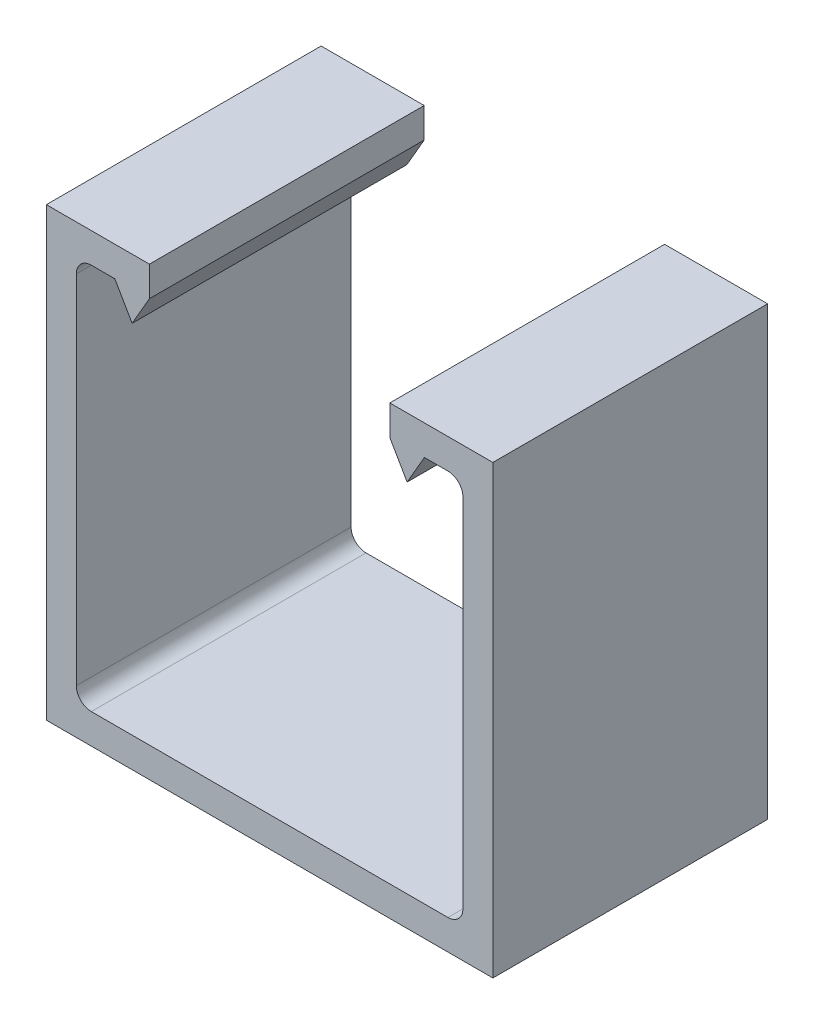
ISO-10303-21;
HEADER;
FILE_DESCRIPTION(('STEP AP214'),'2;1');
FILE_NAME('part.step','',(''),(''),'','','');
FILE_SCHEMA(('AUTOMOTIVE_DESIGN { 1 0 10303 214 1 1 1 1 }'));
ENDSEC;
DATA;
#1=APPLICATION_CONTEXT('core data for automotive mechanical design processes');
#2=APPLICATION_PROTOCOL_DEFINITION('international standard','automotive_design',2000,#1);
#3=PRODUCT_CONTEXT('',#1,'mechanical');
#4=PRODUCT('Part','Part','',(#3));
#5=PRODUCT_RELATED_PRODUCT_CATEGORY('part','',(#4));
#6=PRODUCT_DEFINITION_FORMATION('','',#4);
#7=PRODUCT_DEFINITION_CONTEXT('part definition',#1,'design');
#8=PRODUCT_DEFINITION('design','',#6,#7);
#9=PRODUCT_DEFINITION_SHAPE('','',#8);
#10=(LENGTH_UNIT() NAMED_UNIT(*) SI_UNIT(.MILLI.,.METRE.));
#11=(NAMED_UNIT(*) PLANE_ANGLE_UNIT() SI_UNIT($,.RADIAN.));
#12=(NAMED_UNIT(*) SI_UNIT($,.STERADIAN.) SOLID_ANGLE_UNIT());
#13=UNCERTAINTY_MEASURE_WITH_UNIT(LENGTH_MEASURE(1.E-05),#10,'distance_accuracy_value','');
#14=(GEOMETRIC_REPRESENTATION_CONTEXT(3) GLOBAL_UNCERTAINTY_ASSIGNED_CONTEXT((#13)) GLOBAL_UNIT_ASSIGNED_CONTEXT((#10,
#11,#12)) REPRESENTATION_CONTEXT('',''));
#15=CARTESIAN_POINT('',(0.,0.,0.));
#16=DIRECTION('',(0.,0.,1.));
#17=DIRECTION('',(1.,0.,0.));
#18=AXIS2_PLACEMENT_3D('',#15,#16,#17);
#19=CARTESIAN_POINT('',(-16.4846,-16.4846,12.7));
#20=DIRECTION('',(0.,0.,-1.));
#21=DIRECTION('',(-1.,0.,0.));
#22=AXIS2_PLACEMENT_3D('',#19,#20,#21);
#23=CYLINDRICAL_SURFACE('',#22,1.3843);
#24=CARTESIAN_POINT('',(-16.4846,-16.4846,-12.7));
#25=DIRECTION('',(0.,0.,-1.));
#26=DIRECTION('',(1.,0.,0.));
#27=AXIS2_PLACEMENT_3D('',#24,#25,#26);
#28=CIRCLE('',#27,1.3843);
#29=CARTESIAN_POINT('',(-16.4846,-17.8689,-12.7));
#30=VERTEX_POINT('',#29);
#31=CARTESIAN_POINT('',(-17.8689,-16.4846,-12.7));
#32=VERTEX_POINT('',#31);
#33=EDGE_CURVE('E200',#30,#32,#28,.T.);
#34=ORIENTED_EDGE('',*,*,#33,.T.);
#35=DIRECTION('',(0.,0.,-1.));
#36=VECTOR('',#35,1.);
#37=CARTESIAN_POINT('',(-17.8689,-16.4846,12.7));
#38=LINE('',#37,#36);
#39=CARTESIAN_POINT('',(-17.8689,-16.4846,12.7));
#40=VERTEX_POINT('',#39);
#41=EDGE_CURVE('E11',#40,#32,#38,.T.);
#42=ORIENTED_EDGE('',*,*,#41,.F.);
#43=CARTESIAN_POINT('',(-16.4846,-16.4846,12.7));
#44=DIRECTION('',(0.,0.,-1.));
#45=DIRECTION('',(1.,0.,0.));
#46=AXIS2_PLACEMENT_3D('',#43,#44,#45);
#47=CIRCLE('',#46,1.3843);
#48=CARTESIAN_POINT('',(-16.4846,-17.8689,12.7));
#49=VERTEX_POINT('',#48);
#50=EDGE_CURVE('E238',#49,#40,#47,.T.);
#51=ORIENTED_EDGE('',*,*,#50,.F.);
#52=DIRECTION('',(0.,0.,-1.));
#53=VECTOR('',#52,1.);
#54=CARTESIAN_POINT('',(-16.4846,-17.8689,12.7));
#55=LINE('',#54,#53);
#56=EDGE_CURVE('E196',#49,#30,#55,.T.);
#57=ORIENTED_EDGE('',*,*,#56,.T.);
#58=EDGE_LOOP('',(#34,#42,#51,#57));
#59=FACE_BOUND('',#58,.T.);
#60=ADVANCED_FACE('F32',(#59),#23,.F.);
#61=CARTESIAN_POINT('',(-17.8689,16.4846,12.7));
#62=DIRECTION('',(-1.,0.,0.));
#63=DIRECTION('',(0.,0.,1.));
#64=AXIS2_PLACEMENT_3D('',#61,#62,#63);
#65=PLANE('',#64);
#66=DIRECTION('',(0.,1.,0.));
#67=VECTOR('',#66,1.);
#68=CARTESIAN_POINT('',(-17.8689,16.4846,-12.7));
#69=LINE('',#68,#67);
#70=CARTESIAN_POINT('',(-17.8689,16.4846,-12.7));
#71=VERTEX_POINT('',#70);
#72=EDGE_CURVE('E203',#32,#71,#69,.T.);
#73=ORIENTED_EDGE('',*,*,#72,.T.);
#74=DIRECTION('',(0.,0.,-1.));
#75=VECTOR('',#74,1.);
#76=CARTESIAN_POINT('',(-17.8689,16.4846,12.7));
#77=LINE('',#76,#75);
#78=CARTESIAN_POINT('',(-17.8689,16.4846,12.7));
#79=VERTEX_POINT('',#78);
#80=EDGE_CURVE('E40',#79,#71,#77,.T.);
#81=ORIENTED_EDGE('',*,*,#80,.F.);
#82=DIRECTION('',(0.,1.,0.));
#83=VECTOR('',#82,1.);
#84=CARTESIAN_POINT('',(-17.8689,16.4846,12.7));
#85=LINE('',#84,#83);
#86=EDGE_CURVE('E127',#40,#79,#85,.T.);
#87=ORIENTED_EDGE('',*,*,#86,.F.);
#88=ORIENTED_EDGE('',*,*,#41,.T.);
#89=EDGE_LOOP('',(#73,#81,#87,#88));
#90=FACE_BOUND('',#89,.T.);
#91=ADVANCED_FACE('F356',(#90),#65,.F.);
#92=CARTESIAN_POINT('',(-16.4846,16.4846,12.7));
#93=DIRECTION('',(0.,0.,-1.));
#94=DIRECTION('',(-1.,0.,0.));
#95=AXIS2_PLACEMENT_3D('',#92,#93,#94);
#96=CYLINDRICAL_SURFACE('',#95,1.3843);
#97=CARTESIAN_POINT('',(-16.4846,16.4846,-12.7));
#98=DIRECTION('',(0.,0.,-1.));
#99=DIRECTION('',(1.,0.,0.));
#100=AXIS2_PLACEMENT_3D('',#97,#98,#99);
#101=CIRCLE('',#100,1.3843);
#102=CARTESIAN_POINT('',(-16.4846,17.8689,-12.7));
#103=VERTEX_POINT('',#102);
#104=EDGE_CURVE('E205',#71,#103,#101,.T.);
#105=ORIENTED_EDGE('',*,*,#104,.T.);
#106=DIRECTION('',(0.,0.,-1.));
#107=VECTOR('',#106,1.);
#108=CARTESIAN_POINT('',(-16.4846,17.8689,12.7));
#109=LINE('',#108,#107);
#110=CARTESIAN_POINT('',(-16.4846,17.8689,12.7));
#111=VERTEX_POINT('',#110);
#112=EDGE_CURVE('E281',#111,#103,#109,.T.);
#113=ORIENTED_EDGE('',*,*,#112,.F.);
#114=CARTESIAN_POINT('',(-16.4846,16.4846,12.7));
#115=DIRECTION('',(0.,0.,-1.));
#116=DIRECTION('',(1.,0.,0.));
#117=AXIS2_PLACEMENT_3D('',#114,#115,#116);
#118=CIRCLE('',#117,1.3843);
#119=EDGE_CURVE('E289',#79,#111,#118,.T.);
#120=ORIENTED_EDGE('',*,*,#119,.F.);
#121=ORIENTED_EDGE('',*,*,#80,.T.);
#122=EDGE_LOOP('',(#105,#113,#120,#121));
#123=FACE_BOUND('',#122,.T.);
#124=ADVANCED_FACE('F287',(#123),#96,.F.);
#125=CARTESIAN_POINT('',(-14.3094039105568,17.8689,12.7));
#126=DIRECTION('',(0.,1.,0.));
#127=DIRECTION('',(-1.,0.,0.));
#128=AXIS2_PLACEMENT_3D('',#125,#126,#127);
#129=PLANE('',#128);
#130=DIRECTION('',(1.,0.,0.));
#131=VECTOR('',#130,1.);
#132=CARTESIAN_POINT('',(-14.3094039105568,17.8689,-12.7));
#133=LINE('',#132,#131);
#134=CARTESIAN_POINT('',(-14.3094039105568,17.8689,-12.7));
#135=VERTEX_POINT('',#134);
#136=EDGE_CURVE('E207',#103,#135,#133,.T.);
#137=ORIENTED_EDGE('',*,*,#136,.T.);
#138=DIRECTION('',(0.,0.,-1.));
#139=VECTOR('',#138,1.);
#140=CARTESIAN_POINT('',(-14.3094039105568,17.8689,12.7));
#141=LINE('',#140,#139);
#142=CARTESIAN_POINT('',(-14.3094039105568,17.8689,12.7));
#143=VERTEX_POINT('',#142);
#144=EDGE_CURVE('E278',#143,#135,#141,.T.);
#145=ORIENTED_EDGE('',*,*,#144,.F.);
#146=DIRECTION('',(1.,0.,0.));
#147=VECTOR('',#146,1.);
#148=CARTESIAN_POINT('',(-14.3094039105568,17.8689,12.7));
#149=LINE('',#148,#147);
#150=EDGE_CURVE('E307',#111,#143,#149,.T.);
#151=ORIENTED_EDGE('',*,*,#150,.F.);
#152=ORIENTED_EDGE('',*,*,#112,.T.);
#153=EDGE_LOOP('',(#137,#145,#151,#152));
#154=FACE_BOUND('',#153,.T.);
#155=ADVANCED_FACE('F298',(#154),#129,.F.);
#156=CARTESIAN_POINT('',(-14.3094039105568,17.8689,12.7));
#157=DIRECTION('',(0.866025404088332,0.499999999473641,0.));
#158=DIRECTION('',(-0.499999999473641,0.866025404088332,0.));
#159=AXIS2_PLACEMENT_3D('',#156,#157,#158);
#160=PLANE('',#159);
#161=DIRECTION('',(0.499999999473641,-0.866025404088332,0.));
#162=VECTOR('',#161,1.);
#163=CARTESIAN_POINT('',(-14.3094039105568,17.8689,-12.7));
#164=LINE('',#163,#162);
#165=CARTESIAN_POINT('',(-12.710951957522,15.1003,-12.7));
#166=VERTEX_POINT('',#165);
#167=EDGE_CURVE('E209',#135,#166,#164,.T.);
#168=ORIENTED_EDGE('',*,*,#167,.T.);
#169=DIRECTION('',(0.,0.,-1.));
#170=VECTOR('',#169,1.);
#171=CARTESIAN_POINT('',(-12.710951957522,15.1003,12.7));
#172=LINE('',#171,#170);
#173=CARTESIAN_POINT('',(-12.710951957522,15.1003,12.7));
#174=VERTEX_POINT('',#173);
#175=EDGE_CURVE('E275',#174,#166,#172,.T.);
#176=ORIENTED_EDGE('',*,*,#175,.F.);
#177=DIRECTION('',(0.499999999473641,-0.866025404088332,0.));
#178=VECTOR('',#177,1.);
#179=CARTESIAN_POINT('',(-14.3094039105568,17.8689,12.7));
#180=LINE('',#179,#178);
#181=EDGE_CURVE('E304',#143,#174,#180,.T.);
#182=ORIENTED_EDGE('',*,*,#181,.F.);
#183=ORIENTED_EDGE('',*,*,#144,.T.);
#184=EDGE_LOOP('',(#168,#176,#182,#183));
#185=FACE_BOUND('',#184,.T.);
#186=ADVANCED_FACE('F302',(#185),#160,.F.);
#187=CARTESIAN_POINT('',(-12.710951957522,15.1003,12.7));
#188=DIRECTION('',(-0.866025403480548,0.500000000526354,0.));
#189=DIRECTION('',(-0.500000000526355,-0.866025403480548,0.));
#190=AXIS2_PLACEMENT_3D('',#187,#188,#189);
#191=PLANE('',#190);
#192=DIRECTION('',(0.500000000526354,0.866025403480548,0.));
#193=VECTOR('',#192,1.);
#194=CARTESIAN_POINT('',(-12.710951957522,15.1003,-12.7));
#195=LINE('',#194,#193);
#196=CARTESIAN_POINT('',(-11.1125,17.8689,-12.7));
#197=VERTEX_POINT('',#196);
#198=EDGE_CURVE('E211',#166,#197,#195,.T.);
#199=ORIENTED_EDGE('',*,*,#198,.T.);
#200=DIRECTION('',(0.,0.,-1.));
#201=VECTOR('',#200,1.);
#202=CARTESIAN_POINT('',(-11.1125,17.8689,12.7));
#203=LINE('',#202,#201);
#204=CARTESIAN_POINT('',(-11.1125,17.8689,12.7));
#205=VERTEX_POINT('',#204);
#206=EDGE_CURVE('E272',#205,#197,#203,.T.);
#207=ORIENTED_EDGE('',*,*,#206,.F.);
#208=DIRECTION('',(0.500000000526354,0.866025403480548,0.));
#209=VECTOR('',#208,1.);
#210=CARTESIAN_POINT('',(-12.710951957522,15.1003,12.7));
#211=LINE('',#210,#209);
#212=EDGE_CURVE('E306',#174,#205,#211,.T.);
#213=ORIENTED_EDGE('',*,*,#212,.F.);
#214=ORIENTED_EDGE('',*,*,#175,.T.);
#215=EDGE_LOOP('',(#199,#207,#213,#214));
#216=FACE_BOUND('',#215,.T.);
#217=ADVANCED_FACE('F369',(#216),#191,.F.);
#218=CARTESIAN_POINT('',(-11.1125,17.8689,12.7));
#219=DIRECTION('',(-1.,0.,0.));
#220=DIRECTION('',(0.,-1.,0.));
#221=AXIS2_PLACEMENT_3D('',#218,#219,#220);
#222=PLANE('',#221);
#223=DIRECTION('',(0.,1.,0.));
#224=VECTOR('',#223,1.);
#225=CARTESIAN_POINT('',(-11.1125,17.8689,-12.7));
#226=LINE('',#225,#224);
#227=CARTESIAN_POINT('',(-11.1125,20.6375,-12.7));
#228=VERTEX_POINT('',#227);
#229=EDGE_CURVE('E213',#197,#228,#226,.T.);
#230=ORIENTED_EDGE('',*,*,#229,.T.);
#231=DIRECTION('',(0.,0.,-1.));
#232=VECTOR('',#231,1.);
#233=CARTESIAN_POINT('',(-11.1125,20.6375,12.7));
#234=LINE('',#233,#232);
#235=CARTESIAN_POINT('',(-11.1125,20.6375,12.7));
#236=VERTEX_POINT('',#235);
#237=EDGE_CURVE('E269',#236,#228,#234,.T.);
#238=ORIENTED_EDGE('',*,*,#237,.F.);
#239=DIRECTION('',(0.,1.,0.));
#240=VECTOR('',#239,1.);
#241=CARTESIAN_POINT('',(-11.1125,17.8689,12.7));
#242=LINE('',#241,#240);
#243=EDGE_CURVE('E309',#205,#236,#242,.T.);
#244=ORIENTED_EDGE('',*,*,#243,.F.);
#245=ORIENTED_EDGE('',*,*,#206,.T.);
#246=EDGE_LOOP('',(#230,#238,#244,#245));
#247=FACE_BOUND('',#246,.T.);
#248=ADVANCED_FACE('F372',(#247),#222,.F.);
#249=CARTESIAN_POINT('',(-11.1125,20.6375,12.7));
#250=DIRECTION('',(0.,-1.,0.));
#251=DIRECTION('',(1.,0.,0.));
#252=AXIS2_PLACEMENT_3D('',#249,#250,#251);
#253=PLANE('',#252);
#254=DIRECTION('',(-1.,0.,0.));
#255=VECTOR('',#254,1.);
#256=CARTESIAN_POINT('',(-11.1125,20.6375,-12.7));
#257=LINE('',#256,#255);
#258=CARTESIAN_POINT('',(-20.6375,20.6375,-12.7));
#259=VERTEX_POINT('',#258);
#260=EDGE_CURVE('E215',#228,#259,#257,.T.);
#261=ORIENTED_EDGE('',*,*,#260,.T.);
#262=DIRECTION('',(0.,0.,-1.));
#263=VECTOR('',#262,1.);
#264=CARTESIAN_POINT('',(-20.6375,20.6375,12.7));
#265=LINE('',#264,#263);
#266=CARTESIAN_POINT('',(-20.6375,20.6375,12.7));
#267=VERTEX_POINT('',#266);
#268=EDGE_CURVE('E266',#267,#259,#265,.T.);
#269=ORIENTED_EDGE('',*,*,#268,.F.);
#270=DIRECTION('',(-1.,0.,0.));
#271=VECTOR('',#270,1.);
#272=CARTESIAN_POINT('',(-11.1125,20.6375,12.7));
#273=LINE('',#272,#271);
#274=EDGE_CURVE('E315',#236,#267,#273,.T.);
#275=ORIENTED_EDGE('',*,*,#274,.F.);
#276=ORIENTED_EDGE('',*,*,#237,.T.);
#277=EDGE_LOOP('',(#261,#269,#275,#276));
#278=FACE_BOUND('',#277,.T.);
#279=ADVANCED_FACE('F376',(#278),#253,.F.);
#280=CARTESIAN_POINT('',(-20.6375,20.6375,12.7));
#281=DIRECTION('',(1.,0.,0.));
#282=DIRECTION('',(0.,1.,0.));
#283=AXIS2_PLACEMENT_3D('',#280,#281,#282);
#284=PLANE('',#283);
#285=DIRECTION('',(0.,-1.,0.));
#286=VECTOR('',#285,1.);
#287=CARTESIAN_POINT('',(-20.6375,20.6375,-12.7));
#288=LINE('',#287,#286);
#289=CARTESIAN_POINT('',(-20.6375,-20.6375,-12.7));
#290=VERTEX_POINT('',#289);
#291=EDGE_CURVE('E217',#259,#290,#288,.T.);
#292=ORIENTED_EDGE('',*,*,#291,.T.);
#293=DIRECTION('',(0.,0.,-1.));
#294=VECTOR('',#293,1.);
#295=CARTESIAN_POINT('',(-20.6375,-20.6375,12.7));
#296=LINE('',#295,#294);
#297=CARTESIAN_POINT('',(-20.6375,-20.6375,12.7));
#298=VERTEX_POINT('',#297);
#299=EDGE_CURVE('E263',#298,#290,#296,.T.);
#300=ORIENTED_EDGE('',*,*,#299,.F.);
#301=DIRECTION('',(0.,-1.,0.));
#302=VECTOR('',#301,1.);
#303=CARTESIAN_POINT('',(-20.6375,20.6375,12.7));
#304=LINE('',#303,#302);
#305=EDGE_CURVE('E317',#267,#298,#304,.T.);
#306=ORIENTED_EDGE('',*,*,#305,.F.);
#307=ORIENTED_EDGE('',*,*,#268,.T.);
#308=EDGE_LOOP('',(#292,#300,#306,#307));
#309=FACE_BOUND('',#308,.T.);
#310=ADVANCED_FACE('F380',(#309),#284,.F.);
#311=CARTESIAN_POINT('',(-20.6375,-20.6375,12.7));
#312=DIRECTION('',(0.,1.,0.));
#313=DIRECTION('',(0.,0.,1.));
#314=AXIS2_PLACEMENT_3D('',#311,#312,#313);
#315=PLANE('',#314);
#316=DIRECTION('',(1.,0.,0.));
#317=VECTOR('',#316,1.);
#318=CARTESIAN_POINT('',(-20.6375,-20.6375,-12.7));
#319=LINE('',#318,#317);
#320=CARTESIAN_POINT('',(20.6375,-20.6375,-12.7));
#321=VERTEX_POINT('',#320);
#322=EDGE_CURVE('E219',#290,#321,#319,.T.);
#323=ORIENTED_EDGE('',*,*,#322,.T.);
#324=DIRECTION('',(0.,0.,-1.));
#325=VECTOR('',#324,1.);
#326=CARTESIAN_POINT('',(20.6375,-20.6375,12.7));
#327=LINE('',#326,#325);
#328=CARTESIAN_POINT('',(20.6375,-20.6375,12.7));
#329=VERTEX_POINT('',#328);
#330=EDGE_CURVE('E260',#329,#321,#327,.T.);
#331=ORIENTED_EDGE('',*,*,#330,.F.);
#332=DIRECTION('',(1.,0.,0.));
#333=VECTOR('',#332,1.);
#334=CARTESIAN_POINT('',(-20.6375,-20.6375,12.7));
#335=LINE('',#334,#333);
#336=EDGE_CURVE('E319',#298,#329,#335,.T.);
#337=ORIENTED_EDGE('',*,*,#336,.F.);
#338=ORIENTED_EDGE('',*,*,#299,.T.);
#339=EDGE_LOOP('',(#323,#331,#337,#338));
#340=FACE_BOUND('',#339,.T.);
#341=ADVANCED_FACE('F384',(#340),#315,.F.);
#342=CARTESIAN_POINT('',(20.6375,-20.6375,12.7));
#343=DIRECTION('',(-1.,0.,0.));
#344=DIRECTION('',(0.,0.,1.));
#345=AXIS2_PLACEMENT_3D('',#342,#343,#344);
#346=PLANE('',#345);
#347=DIRECTION('',(0.,1.,0.));
#348=VECTOR('',#347,1.);
#349=CARTESIAN_POINT('',(20.6375,-20.6375,-12.7));
#350=LINE('',#349,#348);
#351=CARTESIAN_POINT('',(20.6375,20.6375,-12.7));
#352=VERTEX_POINT('',#351);
#353=EDGE_CURVE('E221',#321,#352,#350,.T.);
#354=ORIENTED_EDGE('',*,*,#353,.T.);
#355=DIRECTION('',(0.,0.,-1.));
#356=VECTOR('',#355,1.);
#357=CARTESIAN_POINT('',(20.6375,20.6375,12.7));
#358=LINE('',#357,#356);
#359=CARTESIAN_POINT('',(20.6375,20.6375,12.7));
#360=VERTEX_POINT('',#359);
#361=EDGE_CURVE('E257',#360,#352,#358,.T.);
#362=ORIENTED_EDGE('',*,*,#361,.F.);
#363=DIRECTION('',(0.,1.,0.));
#364=VECTOR('',#363,1.);
#365=CARTESIAN_POINT('',(20.6375,-20.6375,12.7));
#366=LINE('',#365,#364);
#367=EDGE_CURVE('E321',#329,#360,#366,.T.);
#368=ORIENTED_EDGE('',*,*,#367,.F.);
#369=ORIENTED_EDGE('',*,*,#330,.T.);
#370=EDGE_LOOP('',(#354,#362,#368,#369));
#371=FACE_BOUND('',#370,.T.);
#372=ADVANCED_FACE('F388',(#371),#346,.F.);
#373=CARTESIAN_POINT('',(20.6375,20.6375,12.7));
#374=DIRECTION('',(0.,-1.,0.));
#375=DIRECTION('',(0.,0.,-1.));
#376=AXIS2_PLACEMENT_3D('',#373,#374,#375);
#377=PLANE('',#376);
#378=DIRECTION('',(-1.,0.,0.));
#379=VECTOR('',#378,1.);
#380=CARTESIAN_POINT('',(20.6375,20.6375,-12.7));
#381=LINE('',#380,#379);
#382=CARTESIAN_POINT('',(11.1125,20.6375,-12.7));
#383=VERTEX_POINT('',#382);
#384=EDGE_CURVE('E223',#352,#383,#381,.T.);
#385=ORIENTED_EDGE('',*,*,#384,.T.);
#386=DIRECTION('',(0.,0.,-1.));
#387=VECTOR('',#386,1.);
#388=CARTESIAN_POINT('',(11.1125,20.6375,12.7));
#389=LINE('',#388,#387);
#390=CARTESIAN_POINT('',(11.1125,20.6375,12.7));
#391=VERTEX_POINT('',#390);
#392=EDGE_CURVE('E254',#391,#383,#389,.T.);
#393=ORIENTED_EDGE('',*,*,#392,.F.);
#394=DIRECTION('',(-1.,0.,0.));
#395=VECTOR('',#394,1.);
#396=CARTESIAN_POINT('',(20.6375,20.6375,12.7));
#397=LINE('',#396,#395);
#398=EDGE_CURVE('E323',#360,#391,#397,.T.);
#399=ORIENTED_EDGE('',*,*,#398,.F.);
#400=ORIENTED_EDGE('',*,*,#361,.T.);
#401=EDGE_LOOP('',(#385,#393,#399,#400));
#402=FACE_BOUND('',#401,.T.);
#403=ADVANCED_FACE('F392',(#402),#377,.F.);
#404=CARTESIAN_POINT('',(11.1125,17.8689,12.7));
#405=DIRECTION('',(1.,0.,0.));
#406=DIRECTION('',(0.,0.,-1.));
#407=AXIS2_PLACEMENT_3D('',#404,#405,#406);
#408=PLANE('',#407);
#409=DIRECTION('',(0.,-1.,0.));
#410=VECTOR('',#409,1.);
#411=CARTESIAN_POINT('',(11.1125,17.8689,-12.7));
#412=LINE('',#411,#410);
#413=CARTESIAN_POINT('',(11.1125,17.8689,-12.7));
#414=VERTEX_POINT('',#413);
#415=EDGE_CURVE('E225',#383,#414,#412,.T.);
#416=ORIENTED_EDGE('',*,*,#415,.T.);
#417=DIRECTION('',(0.,0.,-1.));
#418=VECTOR('',#417,1.);
#419=CARTESIAN_POINT('',(11.1125,17.8689,12.7));
#420=LINE('',#419,#418);
#421=CARTESIAN_POINT('',(11.1125,17.8689,12.7));
#422=VERTEX_POINT('',#421);
#423=EDGE_CURVE('E251',#422,#414,#420,.T.);
#424=ORIENTED_EDGE('',*,*,#423,.F.);
#425=DIRECTION('',(0.,-1.,0.));
#426=VECTOR('',#425,1.);
#427=CARTESIAN_POINT('',(11.1125,17.8689,12.7));
#428=LINE('',#427,#426);
#429=EDGE_CURVE('E325',#391,#422,#428,.T.);
#430=ORIENTED_EDGE('',*,*,#429,.F.);
#431=ORIENTED_EDGE('',*,*,#392,.T.);
#432=EDGE_LOOP('',(#416,#424,#430,#431));
#433=FACE_BOUND('',#432,.T.);
#434=ADVANCED_FACE('F396',(#433),#408,.F.);
#435=CARTESIAN_POINT('',(12.710951957522,15.1003,12.7));
#436=DIRECTION('',(0.866025403480548,0.500000000526354,0.));
#437=DIRECTION('',(-0.500000000526354,0.866025403480548,0.));
#438=AXIS2_PLACEMENT_3D('',#435,#436,#437);
#439=PLANE('',#438);
#440=DIRECTION('',(0.500000000526354,-0.866025403480548,0.));
#441=VECTOR('',#440,1.);
#442=CARTESIAN_POINT('',(12.710951957522,15.1003,-12.7));
#443=LINE('',#442,#441);
#444=CARTESIAN_POINT('',(12.710951957522,15.1003,-12.7));
#445=VERTEX_POINT('',#444);
#446=EDGE_CURVE('E227',#414,#445,#443,.T.);
#447=ORIENTED_EDGE('',*,*,#446,.T.);
#448=DIRECTION('',(0.,0.,-1.));
#449=VECTOR('',#448,1.);
#450=CARTESIAN_POINT('',(12.710951957522,15.1003,12.7));
#451=LINE('',#450,#449);
#452=CARTESIAN_POINT('',(12.710951957522,15.1003,12.7));
#453=VERTEX_POINT('',#452);
#454=EDGE_CURVE('E248',#453,#445,#451,.T.);
#455=ORIENTED_EDGE('',*,*,#454,.F.);
#456=DIRECTION('',(0.500000000526354,-0.866025403480548,0.));
#457=VECTOR('',#456,1.);
#458=CARTESIAN_POINT('',(12.710951957522,15.1003,12.7));
#459=LINE('',#458,#457);
#460=EDGE_CURVE('E327',#422,#453,#459,.T.);
#461=ORIENTED_EDGE('',*,*,#460,.F.);
#462=ORIENTED_EDGE('',*,*,#423,.T.);
#463=EDGE_LOOP('',(#447,#455,#461,#462));
#464=FACE_BOUND('',#463,.T.);
#465=ADVANCED_FACE('F400',(#464),#439,.F.);
#466=CARTESIAN_POINT('',(14.3094039105568,17.8689,12.7));
#467=DIRECTION('',(-0.866025404088332,0.499999999473642,0.));
#468=DIRECTION('',(-0.499999999473642,-0.866025404088332,0.));
#469=AXIS2_PLACEMENT_3D('',#466,#467,#468);
#470=PLANE('',#469);
#471=DIRECTION('',(0.499999999473642,0.866025404088331,0.));
#472=VECTOR('',#471,1.);
#473=CARTESIAN_POINT('',(14.3094039105568,17.8689,-12.7));
#474=LINE('',#473,#472);
#475=CARTESIAN_POINT('',(14.3094039105568,17.8689,-12.7));
#476=VERTEX_POINT('',#475);
#477=EDGE_CURVE('E229',#445,#476,#474,.T.);
#478=ORIENTED_EDGE('',*,*,#477,.T.);
#479=DIRECTION('',(0.,0.,-1.));
#480=VECTOR('',#479,1.);
#481=CARTESIAN_POINT('',(14.3094039105568,17.8689,12.7));
#482=LINE('',#481,#480);
#483=CARTESIAN_POINT('',(14.3094039105568,17.8689,12.7));
#484=VERTEX_POINT('',#483);
#485=EDGE_CURVE('E245',#484,#476,#482,.T.);
#486=ORIENTED_EDGE('',*,*,#485,.F.);
#487=DIRECTION('',(0.499999999473642,0.866025404088331,0.));
#488=VECTOR('',#487,1.);
#489=CARTESIAN_POINT('',(14.3094039105568,17.8689,12.7));
#490=LINE('',#489,#488);
#491=EDGE_CURVE('E329',#453,#484,#490,.T.);
#492=ORIENTED_EDGE('',*,*,#491,.F.);
#493=ORIENTED_EDGE('',*,*,#454,.T.);
#494=EDGE_LOOP('',(#478,#486,#492,#493));
#495=FACE_BOUND('',#494,.T.);
#496=ADVANCED_FACE('F404',(#495),#470,.F.);
#497=CARTESIAN_POINT('',(16.4846,17.8689,12.7));
#498=DIRECTION('',(0.,1.,0.));
#499=DIRECTION('',(-1.,0.,0.));
#500=AXIS2_PLACEMENT_3D('',#497,#498,#499);
#501=PLANE('',#500);
#502=DIRECTION('',(1.,0.,0.));
#503=VECTOR('',#502,1.);
#504=CARTESIAN_POINT('',(16.4846,17.8689,-12.7));
#505=LINE('',#504,#503);
#506=CARTESIAN_POINT('',(16.4846,17.8689,-12.7));
#507=VERTEX_POINT('',#506);
#508=EDGE_CURVE('E231',#476,#507,#505,.T.);
#509=ORIENTED_EDGE('',*,*,#508,.T.);
#510=DIRECTION('',(0.,0.,-1.));
#511=VECTOR('',#510,1.);
#512=CARTESIAN_POINT('',(16.4846,17.8689,12.7));
#513=LINE('',#512,#511);
#514=CARTESIAN_POINT('',(16.4846,17.8689,12.7));
#515=VERTEX_POINT('',#514);
#516=EDGE_CURVE('E242',#515,#507,#513,.T.);
#517=ORIENTED_EDGE('',*,*,#516,.F.);
#518=DIRECTION('',(1.,0.,0.));
#519=VECTOR('',#518,1.);
#520=CARTESIAN_POINT('',(16.4846,17.8689,12.7));
#521=LINE('',#520,#519);
#522=EDGE_CURVE('E331',#484,#515,#521,.T.);
#523=ORIENTED_EDGE('',*,*,#522,.F.);
#524=ORIENTED_EDGE('',*,*,#485,.T.);
#525=EDGE_LOOP('',(#509,#517,#523,#524));
#526=FACE_BOUND('',#525,.T.);
#527=ADVANCED_FACE('F337',(#526),#501,.F.);
#528=CARTESIAN_POINT('',(16.4846,16.4846,12.7));
#529=DIRECTION('',(0.,0.,-1.));
#530=DIRECTION('',(-1.,0.,0.));
#531=AXIS2_PLACEMENT_3D('',#528,#529,#530);
#532=CYLINDRICAL_SURFACE('',#531,1.3843);
#533=CARTESIAN_POINT('',(16.4846,16.4846,-12.7));
#534=DIRECTION('',(0.,0.,-1.));
#535=DIRECTION('',(1.,0.,0.));
#536=AXIS2_PLACEMENT_3D('',#533,#534,#535);
#537=CIRCLE('',#536,1.3843);
#538=CARTESIAN_POINT('',(17.8689,16.4846,-12.7));
#539=VERTEX_POINT('',#538);
#540=EDGE_CURVE('E233',#507,#539,#537,.T.);
#541=ORIENTED_EDGE('',*,*,#540,.T.);
#542=DIRECTION('',(0.,0.,-1.));
#543=VECTOR('',#542,1.);
#544=CARTESIAN_POINT('',(17.8689,16.4846,12.7));
#545=LINE('',#544,#543);
#546=CARTESIAN_POINT('',(17.8689,16.4846,12.7));
#547=VERTEX_POINT('',#546);
#548=EDGE_CURVE('E191',#547,#539,#545,.T.);
#549=ORIENTED_EDGE('',*,*,#548,.F.);
#550=CARTESIAN_POINT('',(16.4846,16.4846,12.7));
#551=DIRECTION('',(0.,0.,-1.));
#552=DIRECTION('',(1.,0.,0.));
#553=AXIS2_PLACEMENT_3D('',#550,#551,#552);
#554=CIRCLE('',#553,1.3843);
#555=EDGE_CURVE('E182',#515,#547,#554,.T.);
#556=ORIENTED_EDGE('',*,*,#555,.F.);
#557=ORIENTED_EDGE('',*,*,#516,.T.);
#558=EDGE_LOOP('',(#541,#549,#556,#557));
#559=FACE_BOUND('',#558,.T.);
#560=ADVANCED_FACE('F341',(#559),#532,.F.);
#561=CARTESIAN_POINT('',(17.8689,-16.4846,12.7));
#562=DIRECTION('',(1.,0.,0.));
#563=DIRECTION('',(0.,1.,0.));
#564=AXIS2_PLACEMENT_3D('',#561,#562,#563);
#565=PLANE('',#564);
#566=DIRECTION('',(0.,-1.,0.));
#567=VECTOR('',#566,1.);
#568=CARTESIAN_POINT('',(17.8689,-16.4846,-12.7));
#569=LINE('',#568,#567);
#570=CARTESIAN_POINT('',(17.8689,-16.4846,-12.7));
#571=VERTEX_POINT('',#570);
#572=EDGE_CURVE('E190',#539,#571,#569,.T.);
#573=ORIENTED_EDGE('',*,*,#572,.T.);
#574=DIRECTION('',(0.,0.,-1.));
#575=VECTOR('',#574,1.);
#576=CARTESIAN_POINT('',(17.8689,-16.4846,12.7));
#577=LINE('',#576,#575);
#578=CARTESIAN_POINT('',(17.8689,-16.4846,12.7));
#579=VERTEX_POINT('',#578);
#580=EDGE_CURVE('E187',#579,#571,#577,.T.);
#581=ORIENTED_EDGE('',*,*,#580,.F.);
#582=DIRECTION('',(0.,-1.,0.));
#583=VECTOR('',#582,1.);
#584=CARTESIAN_POINT('',(17.8689,-16.4846,12.7));
#585=LINE('',#584,#583);
#586=EDGE_CURVE('E176',#547,#579,#585,.T.);
#587=ORIENTED_EDGE('',*,*,#586,.F.);
#588=ORIENTED_EDGE('',*,*,#548,.T.);
#589=EDGE_LOOP('',(#573,#581,#587,#588));
#590=FACE_BOUND('',#589,.T.);
#591=ADVANCED_FACE('F188',(#590),#565,.F.);
#592=CARTESIAN_POINT('',(16.4846,-16.4846,12.7));
#593=DIRECTION('',(0.,0.,-1.));
#594=DIRECTION('',(-1.,0.,0.));
#595=AXIS2_PLACEMENT_3D('',#592,#593,#594);
#596=CYLINDRICAL_SURFACE('',#595,1.3843);
#597=CARTESIAN_POINT('',(16.4846,-16.4846,-12.7));
#598=DIRECTION('',(0.,0.,-1.));
#599=DIRECTION('',(1.,0.,0.));
#600=AXIS2_PLACEMENT_3D('',#597,#598,#599);
#601=CIRCLE('',#600,1.3843);
#602=CARTESIAN_POINT('',(16.4846,-17.8689,-12.7));
#603=VERTEX_POINT('',#602);
#604=EDGE_CURVE('E113',#571,#603,#601,.T.);
#605=ORIENTED_EDGE('',*,*,#604,.T.);
#606=DIRECTION('',(0.,0.,-1.));
#607=VECTOR('',#606,1.);
#608=CARTESIAN_POINT('',(16.4846,-17.8689,12.7));
#609=LINE('',#608,#607);
#610=CARTESIAN_POINT('',(16.4846,-17.8689,12.7));
#611=VERTEX_POINT('',#610);
#612=EDGE_CURVE('E192',#611,#603,#609,.T.);
#613=ORIENTED_EDGE('',*,*,#612,.F.);
#614=CARTESIAN_POINT('',(16.4846,-16.4846,12.7));
#615=DIRECTION('',(0.,0.,-1.));
#616=DIRECTION('',(1.,0.,0.));
#617=AXIS2_PLACEMENT_3D('',#614,#615,#616);
#618=CIRCLE('',#617,1.3843);
#619=EDGE_CURVE('E180',#579,#611,#618,.T.);
#620=ORIENTED_EDGE('',*,*,#619,.F.);
#621=ORIENTED_EDGE('',*,*,#580,.T.);
#622=EDGE_LOOP('',(#605,#613,#620,#621));
#623=FACE_BOUND('',#622,.T.);
#624=ADVANCED_FACE('F194',(#623),#596,.F.);
#625=CARTESIAN_POINT('',(-16.4846,-17.8689,12.7));
#626=DIRECTION('',(0.,-1.,0.));
#627=DIRECTION('',(0.,0.,-1.));
#628=AXIS2_PLACEMENT_3D('',#625,#626,#627);
#629=PLANE('',#628);
#630=DIRECTION('',(-1.,0.,0.));
#631=VECTOR('',#630,1.);
#632=CARTESIAN_POINT('',(-16.4846,-17.8689,-12.7));
#633=LINE('',#632,#631);
#634=EDGE_CURVE('E119',#603,#30,#633,.T.);
#635=ORIENTED_EDGE('',*,*,#634,.T.);
#636=ORIENTED_EDGE('',*,*,#56,.F.);
#637=DIRECTION('',(-1.,0.,0.));
#638=VECTOR('',#637,1.);
#639=CARTESIAN_POINT('',(-16.4846,-17.8689,12.7));
#640=LINE('',#639,#638);
#641=EDGE_CURVE('E48',#611,#49,#640,.T.);
#642=ORIENTED_EDGE('',*,*,#641,.F.);
#643=ORIENTED_EDGE('',*,*,#612,.T.);
#644=EDGE_LOOP('',(#635,#636,#642,#643));
#645=FACE_BOUND('',#644,.T.);
#646=ADVANCED_FACE('F345',(#645),#629,.F.);
#647=CARTESIAN_POINT('',(-16.4846,-16.4846,12.7));
#648=DIRECTION('',(0.,0.,1.));
#649=DIRECTION('',(1.,0.,0.));
#650=AXIS2_PLACEMENT_3D('',#647,#648,#649);
#651=PLANE('',#650);
#652=ORIENTED_EDGE('',*,*,#50,.T.);
#653=ORIENTED_EDGE('',*,*,#86,.T.);
#654=ORIENTED_EDGE('',*,*,#119,.T.);
#655=ORIENTED_EDGE('',*,*,#150,.T.);
#656=ORIENTED_EDGE('',*,*,#181,.T.);
#657=ORIENTED_EDGE('',*,*,#212,.T.);
#658=ORIENTED_EDGE('',*,*,#243,.T.);
#659=ORIENTED_EDGE('',*,*,#274,.T.);
#660=ORIENTED_EDGE('',*,*,#305,.T.);
#661=ORIENTED_EDGE('',*,*,#336,.T.);
#662=ORIENTED_EDGE('',*,*,#367,.T.);
#663=ORIENTED_EDGE('',*,*,#398,.T.);
#664=ORIENTED_EDGE('',*,*,#429,.T.);
#665=ORIENTED_EDGE('',*,*,#460,.T.);
#666=ORIENTED_EDGE('',*,*,#491,.T.);
#667=ORIENTED_EDGE('',*,*,#522,.T.);
#668=ORIENTED_EDGE('',*,*,#555,.T.);
#669=ORIENTED_EDGE('',*,*,#586,.T.);
#670=ORIENTED_EDGE('',*,*,#619,.T.);
#671=ORIENTED_EDGE('',*,*,#641,.T.);
#672=EDGE_LOOP('',(#652,#653,#654,#655,#656,#657,#658,#659,#660,#661,#662,#663,#664,#665,#666,
#667,#668,#669,#670,#671));
#673=FACE_BOUND('',#672,.T.);
#674=ADVANCED_FACE('F178',(#673),#651,.T.);
#675=CARTESIAN_POINT('',(-16.4846,-16.4846,-12.7));
#676=DIRECTION('',(0.,0.,1.));
#677=DIRECTION('',(1.,0.,0.));
#678=AXIS2_PLACEMENT_3D('',#675,#676,#677);
#679=PLANE('',#678);
#680=ORIENTED_EDGE('',*,*,#33,.F.);
#681=ORIENTED_EDGE('',*,*,#634,.F.);
#682=ORIENTED_EDGE('',*,*,#604,.F.);
#683=ORIENTED_EDGE('',*,*,#572,.F.);
#684=ORIENTED_EDGE('',*,*,#540,.F.);
#685=ORIENTED_EDGE('',*,*,#508,.F.);
#686=ORIENTED_EDGE('',*,*,#477,.F.);
#687=ORIENTED_EDGE('',*,*,#446,.F.);
#688=ORIENTED_EDGE('',*,*,#415,.F.);
#689=ORIENTED_EDGE('',*,*,#384,.F.);
#690=ORIENTED_EDGE('',*,*,#353,.F.);
#691=ORIENTED_EDGE('',*,*,#322,.F.);
#692=ORIENTED_EDGE('',*,*,#291,.F.);
#693=ORIENTED_EDGE('',*,*,#260,.F.);
#694=ORIENTED_EDGE('',*,*,#229,.F.);
#695=ORIENTED_EDGE('',*,*,#198,.F.);
#696=ORIENTED_EDGE('',*,*,#167,.F.);
#697=ORIENTED_EDGE('',*,*,#136,.F.);
#698=ORIENTED_EDGE('',*,*,#104,.F.);
#699=ORIENTED_EDGE('',*,*,#72,.F.);
#700=EDGE_LOOP('',(#680,#681,#682,#683,#684,#685,#686,#687,#688,#689,#690,#691,#692,#693,#694,
#695,#696,#697,#698,#699));
#701=FACE_BOUND('',#700,.T.);
#702=ADVANCED_FACE('F293',(#701),#679,.F.);
#703=CLOSED_SHELL('',(#60,#91,#124,#155,#186,#217,#248,#279,#310,#341,#372,#403,#434,#465,#496,
#527,#560,#591,#624,#646,#674,#702));
#704=MANIFOLD_SOLID_BREP('B2',#703);
#705=ADVANCED_BREP_SHAPE_REPRESENTATION('',(#18,#704),#14);
#706=SHAPE_DEFINITION_REPRESENTATION(#9,#705);
ENDSEC;
END-ISO-10303-21;
